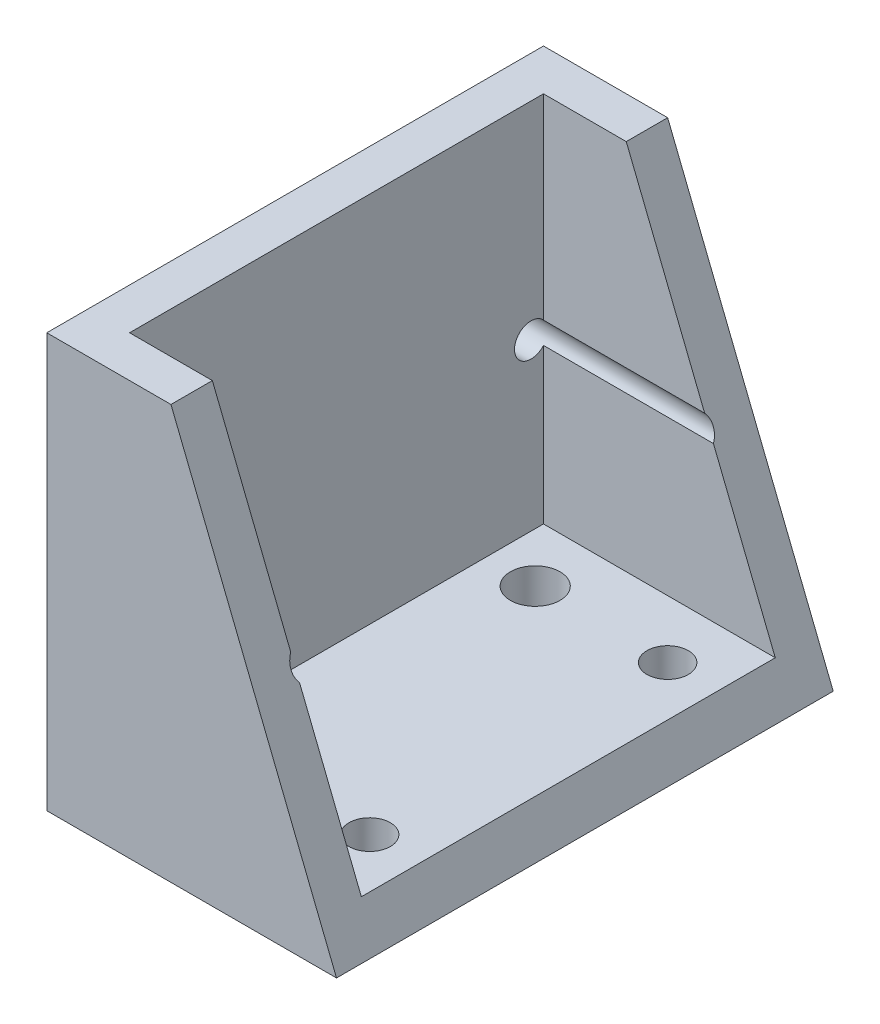
ISO-10303-21;
HEADER;
FILE_DESCRIPTION(('STEP AP214'),'2;1');
FILE_NAME('part.step','',(''),(''),'','','');
FILE_SCHEMA(('AUTOMOTIVE_DESIGN { 1 0 10303 214 1 1 1 1 }'));
ENDSEC;
DATA;
#1=APPLICATION_CONTEXT('core data for automotive mechanical design processes');
#2=APPLICATION_PROTOCOL_DEFINITION('international standard','automotive_design',2000,#1);
#3=PRODUCT_CONTEXT('',#1,'mechanical');
#4=PRODUCT('Part','Part','',(#3));
#5=PRODUCT_RELATED_PRODUCT_CATEGORY('part','',(#4));
#6=PRODUCT_DEFINITION_FORMATION('','',#4);
#7=PRODUCT_DEFINITION_CONTEXT('part definition',#1,'design');
#8=PRODUCT_DEFINITION('design','',#6,#7);
#9=PRODUCT_DEFINITION_SHAPE('','',#8);
#10=(LENGTH_UNIT() NAMED_UNIT(*) SI_UNIT(.MILLI.,.METRE.));
#11=(NAMED_UNIT(*) PLANE_ANGLE_UNIT() SI_UNIT($,.RADIAN.));
#12=(NAMED_UNIT(*) SI_UNIT($,.STERADIAN.) SOLID_ANGLE_UNIT());
#13=UNCERTAINTY_MEASURE_WITH_UNIT(LENGTH_MEASURE(1.E-05),#10,'distance_accuracy_value','');
#14=(GEOMETRIC_REPRESENTATION_CONTEXT(3) GLOBAL_UNCERTAINTY_ASSIGNED_CONTEXT((#13)) GLOBAL_UNIT_ASSIGNED_CONTEXT((#10,
#11,#12)) REPRESENTATION_CONTEXT('',''));
#15=CARTESIAN_POINT('',(0.,0.,0.));
#16=DIRECTION('',(0.,0.,1.));
#17=DIRECTION('',(1.,0.,0.));
#18=AXIS2_PLACEMENT_3D('',#15,#16,#17);
#19=CARTESIAN_POINT('',(-41.3425117527549,-2.12765957446807,5.));
#20=DIRECTION('',(0.,0.,-1.));
#21=DIRECTION('',(-1.,0.,0.));
#22=AXIS2_PLACEMENT_3D('',#19,#20,#21);
#23=PLANE('',#22);
#24=DIRECTION('',(0.371390676354104,-0.928476690885259,0.));
#25=VECTOR('',#24,1.);
#26=CARTESIAN_POINT('',(-31.3425117527549,42.8723404255319,4.99999999999999));
#27=LINE('',#26,#25);
#28=CARTESIAN_POINT('',(-20.813361490542,16.5494647699996,5.));
#29=VERTEX_POINT('',#28);
#30=CARTESIAN_POINT('',(-13.3425117527549,-2.12765957446807,5.));
#31=VERTEX_POINT('',#30);
#32=EDGE_CURVE('E134',#29,#31,#27,.T.);
#33=ORIENTED_EDGE('',*,*,#32,.F.);
#34=DIRECTION('',(-1.,0.,0.));
#35=VECTOR('',#34,1.);
#36=CARTESIAN_POINT('',(-11.3425117527549,16.5494647699996,5.));
#37=LINE('',#36,#35);
#38=CARTESIAN_POINT('',(-41.3425117527549,16.5494647699996,5.));
#39=VERTEX_POINT('',#38);
#40=EDGE_CURVE('E122',#29,#39,#37,.T.);
#41=ORIENTED_EDGE('',*,*,#40,.T.);
#42=DIRECTION('',(0.,1.,0.));
#43=VECTOR('',#42,1.);
#44=CARTESIAN_POINT('',(-41.3425117527549,-2.12765957446807,5.));
#45=LINE('',#44,#43);
#46=CARTESIAN_POINT('',(-41.3425117527549,-2.12765957446807,5.));
#47=VERTEX_POINT('',#46);
#48=EDGE_CURVE('E132',#47,#39,#45,.T.);
#49=ORIENTED_EDGE('',*,*,#48,.F.);
#50=DIRECTION('',(-1.,0.,0.));
#51=VECTOR('',#50,1.);
#52=CARTESIAN_POINT('',(-41.3425117527549,-2.12765957446807,5.));
#53=LINE('',#52,#51);
#54=EDGE_CURVE('E214',#31,#47,#53,.T.);
#55=ORIENTED_EDGE('',*,*,#54,.F.);
#56=EDGE_LOOP('',(#33,#41,#49,#55));
#57=FACE_BOUND('',#56,.T.);
#58=ADVANCED_FACE('F35',(#57),#23,.F.);
#59=CARTESIAN_POINT('',(-6.84445933843047,-2.12765957446807,55.));
#60=DIRECTION('',(0.,0.,1.));
#61=DIRECTION('',(1.,0.,0.));
#62=AXIS2_PLACEMENT_3D('',#59,#60,#61);
#63=PLANE('',#62);
#64=DIRECTION('',(-0.371390676354104,0.928476690885259,0.));
#65=VECTOR('',#64,1.);
#66=CARTESIAN_POINT('',(-31.3425117527549,42.8723404255319,55.));
#67=LINE('',#66,#65);
#68=CARTESIAN_POINT('',(-21.8716620149679,19.1952160810642,55.));
#69=VERTEX_POINT('',#68);
#70=CARTESIAN_POINT('',(-31.3425117527549,42.8723404255319,55.));
#71=VERTEX_POINT('',#70);
#72=EDGE_CURVE('E141',#69,#71,#67,.T.);
#73=ORIENTED_EDGE('',*,*,#72,.F.);
#74=DIRECTION('',(-1.,0.,0.));
#75=VECTOR('',#74,1.);
#76=CARTESIAN_POINT('',(-11.3425117527549,19.1952160810642,55.));
#77=LINE('',#76,#75);
#78=CARTESIAN_POINT('',(-41.3425117527549,19.1952160810642,55.));
#79=VERTEX_POINT('',#78);
#80=EDGE_CURVE('E234',#69,#79,#77,.T.);
#81=ORIENTED_EDGE('',*,*,#80,.T.);
#82=DIRECTION('',(0.,1.,0.));
#83=VECTOR('',#82,1.);
#84=CARTESIAN_POINT('',(-41.3425117527549,-2.12765957446807,55.));
#85=LINE('',#84,#83);
#86=CARTESIAN_POINT('',(-41.3425117527549,42.8723404255319,55.));
#87=VERTEX_POINT('',#86);
#88=EDGE_CURVE('E152',#79,#87,#85,.T.);
#89=ORIENTED_EDGE('',*,*,#88,.T.);
#90=DIRECTION('',(1.,0.,0.));
#91=VECTOR('',#90,1.);
#92=CARTESIAN_POINT('',(-6.84445933843047,42.8723404255319,55.));
#93=LINE('',#92,#91);
#94=EDGE_CURVE('E149',#87,#71,#93,.T.);
#95=ORIENTED_EDGE('',*,*,#94,.T.);
#96=EDGE_LOOP('',(#73,#81,#89,#95));
#97=FACE_BOUND('',#96,.T.);
#98=ADVANCED_FACE('F287',(#97),#63,.F.);
#99=CARTESIAN_POINT('',(-31.3425117527549,42.8723404255319,60.));
#100=DIRECTION('',(-0.928476690885259,-0.371390676354104,0.));
#101=DIRECTION('',(0.371390676354104,-0.928476690885259,0.));
#102=AXIS2_PLACEMENT_3D('',#99,#100,#101);
#103=PLANE('',#102);
#104=CARTESIAN_POINT('',(-13.3425117527549,-2.12765957446807,55.));
#105=VERTEX_POINT('',#104);
#106=CARTESIAN_POINT('',(-20.813361490542,16.5494647699996,55.));
#107=VERTEX_POINT('',#106);
#108=EDGE_CURVE('E144',#105,#107,#67,.T.);
#109=ORIENTED_EDGE('',*,*,#108,.T.);
#110=CARTESIAN_POINT('',(-21.3425117527549,17.8723404255319,53.5));
#111=DIRECTION('',(-0.928476690885259,-0.371390676354104,0.));
#112=DIRECTION('',(-0.371390676354104,0.928476690885259,0.));
#113=AXIS2_PLACEMENT_3D('',#110,#111,#112);
#114=ELLIPSE('',#113,2.15406592285381,2.);
#115=EDGE_CURVE('E231',#107,#69,#114,.T.);
#116=ORIENTED_EDGE('',*,*,#115,.T.);
#117=ORIENTED_EDGE('',*,*,#72,.T.);
#118=DIRECTION('',(0.,0.,-1.));
#119=VECTOR('',#118,1.);
#120=CARTESIAN_POINT('',(-31.3425117527549,42.8723404255319,60.));
#121=LINE('',#120,#119);
#122=CARTESIAN_POINT('',(-31.3425117527549,42.8723404255319,60.));
#123=VERTEX_POINT('',#122);
#124=EDGE_CURVE('E186',#123,#71,#121,.T.);
#125=ORIENTED_EDGE('',*,*,#124,.F.);
#126=DIRECTION('',(-0.371390676354104,0.928476690885259,0.));
#127=VECTOR('',#126,1.);
#128=CARTESIAN_POINT('',(-31.3425117527549,42.8723404255319,60.));
#129=LINE('',#128,#127);
#130=CARTESIAN_POINT('',(-11.3425117527549,-7.12765957446808,60.));
#131=VERTEX_POINT('',#130);
#132=EDGE_CURVE('E159',#131,#123,#129,.T.);
#133=ORIENTED_EDGE('',*,*,#132,.F.);
#134=DIRECTION('',(0.,0.,-1.));
#135=VECTOR('',#134,1.);
#136=CARTESIAN_POINT('',(-11.3425117527549,-7.12765957446808,60.));
#137=LINE('',#136,#135);
#138=CARTESIAN_POINT('',(-11.3425117527549,-7.12765957446808,0.));
#139=VERTEX_POINT('',#138);
#140=EDGE_CURVE('E169',#131,#139,#137,.T.);
#141=ORIENTED_EDGE('',*,*,#140,.T.);
#142=DIRECTION('',(-0.371390676354104,0.928476690885259,0.));
#143=VECTOR('',#142,1.);
#144=CARTESIAN_POINT('',(-31.3425117527549,42.8723404255319,0.));
#145=LINE('',#144,#143);
#146=CARTESIAN_POINT('',(-31.3425117527549,42.8723404255319,0.));
#147=VERTEX_POINT('',#146);
#148=EDGE_CURVE('E158',#139,#147,#145,.T.);
#149=ORIENTED_EDGE('',*,*,#148,.T.);
#150=CARTESIAN_POINT('',(-31.3425117527549,42.8723404255319,5.));
#151=VERTEX_POINT('',#150);
#152=EDGE_CURVE('E185',#151,#147,#121,.T.);
#153=ORIENTED_EDGE('',*,*,#152,.F.);
#154=CARTESIAN_POINT('',(-21.8716620149679,19.1952160810642,5.));
#155=VERTEX_POINT('',#154);
#156=EDGE_CURVE('E155',#151,#155,#27,.T.);
#157=ORIENTED_EDGE('',*,*,#156,.T.);
#158=CARTESIAN_POINT('',(-21.3425117527549,17.8723404255319,6.50000000000001));
#159=DIRECTION('',(-0.928476690885259,-0.371390676354104,0.));
#160=DIRECTION('',(-0.371390676354104,0.928476690885259,0.));
#161=AXIS2_PLACEMENT_3D('',#158,#159,#160);
#162=ELLIPSE('',#161,2.15406592285381,2.);
#163=EDGE_CURVE('E135',#155,#29,#162,.T.);
#164=ORIENTED_EDGE('',*,*,#163,.T.);
#165=ORIENTED_EDGE('',*,*,#32,.T.);
#166=DIRECTION('',(0.,0.,1.));
#167=VECTOR('',#166,1.);
#168=CARTESIAN_POINT('',(-13.3425117527549,-2.12765957446807,60.));
#169=LINE('',#168,#167);
#170=EDGE_CURVE('E127',#31,#105,#169,.T.);
#171=ORIENTED_EDGE('',*,*,#170,.T.);
#172=EDGE_LOOP('',(#109,#116,#117,#125,#133,#141,#149,#153,#157,#164,#165,#171));
#173=FACE_BOUND('',#172,.T.);
#174=ADVANCED_FACE('F37',(#173),#103,.F.);
#175=CARTESIAN_POINT('',(-46.3425117527549,42.8723404255319,60.));
#176=DIRECTION('',(0.,-1.,0.));
#177=DIRECTION('',(0.,0.,-1.));
#178=AXIS2_PLACEMENT_3D('',#175,#176,#177);
#179=PLANE('',#178);
#180=DIRECTION('',(0.,0.,1.));
#181=VECTOR('',#180,1.);
#182=CARTESIAN_POINT('',(-41.3425117527549,42.8723404255319,55.));
#183=LINE('',#182,#181);
#184=CARTESIAN_POINT('',(-41.3425117527549,42.8723404255319,5.));
#185=VERTEX_POINT('',#184);
#186=EDGE_CURVE('E206',#185,#87,#183,.T.);
#187=ORIENTED_EDGE('',*,*,#186,.F.);
#188=DIRECTION('',(1.,0.,0.));
#189=VECTOR('',#188,1.);
#190=CARTESIAN_POINT('',(-46.3425117527549,42.8723404255319,5.));
#191=LINE('',#190,#189);
#192=EDGE_CURVE('E189',#185,#151,#191,.T.);
#193=ORIENTED_EDGE('',*,*,#192,.T.);
#194=ORIENTED_EDGE('',*,*,#152,.T.);
#195=DIRECTION('',(-1.,0.,0.));
#196=VECTOR('',#195,1.);
#197=CARTESIAN_POINT('',(-46.3425117527549,42.8723404255319,0.));
#198=LINE('',#197,#196);
#199=CARTESIAN_POINT('',(-46.3425117527549,42.8723404255319,0.));
#200=VERTEX_POINT('',#199);
#201=EDGE_CURVE('E172',#147,#200,#198,.T.);
#202=ORIENTED_EDGE('',*,*,#201,.T.);
#203=DIRECTION('',(0.,0.,-1.));
#204=VECTOR('',#203,1.);
#205=CARTESIAN_POINT('',(-46.3425117527549,42.8723404255319,60.));
#206=LINE('',#205,#204);
#207=CARTESIAN_POINT('',(-46.3425117527549,42.8723404255319,60.));
#208=VERTEX_POINT('',#207);
#209=EDGE_CURVE('E182',#208,#200,#206,.T.);
#210=ORIENTED_EDGE('',*,*,#209,.F.);
#211=DIRECTION('',(-1.,0.,0.));
#212=VECTOR('',#211,1.);
#213=CARTESIAN_POINT('',(-46.3425117527549,42.8723404255319,60.));
#214=LINE('',#213,#212);
#215=EDGE_CURVE('E162',#123,#208,#214,.T.);
#216=ORIENTED_EDGE('',*,*,#215,.F.);
#217=ORIENTED_EDGE('',*,*,#124,.T.);
#218=ORIENTED_EDGE('',*,*,#94,.F.);
#219=EDGE_LOOP('',(#187,#193,#194,#202,#210,#216,#217,#218));
#220=FACE_BOUND('',#219,.T.);
#221=ADVANCED_FACE('F253',(#220),#179,.F.);
#222=CARTESIAN_POINT('',(-46.3425117527549,-7.12765957446808,60.));
#223=DIRECTION('',(1.,0.,0.));
#224=DIRECTION('',(0.,0.,-1.));
#225=AXIS2_PLACEMENT_3D('',#222,#223,#224);
#226=PLANE('',#225);
#227=CARTESIAN_POINT('',(-46.3425117527549,17.8723404255319,53.5));
#228=DIRECTION('',(-1.,0.,0.));
#229=DIRECTION('',(0.,0.,1.));
#230=AXIS2_PLACEMENT_3D('',#227,#228,#229);
#231=CIRCLE('',#230,2.);
#232=CARTESIAN_POINT('',(-46.3425117527549,17.8723404255319,55.5));
#233=VERTEX_POINT('',#232);
#234=EDGE_CURVE('E240',#233,#233,#231,.T.);
#235=ORIENTED_EDGE('',*,*,#234,.F.);
#236=EDGE_LOOP('',(#235));
#237=FACE_BOUND('',#236,.T.);
#238=CARTESIAN_POINT('',(-46.3425117527549,17.8723404255319,6.50000000000001));
#239=DIRECTION('',(-1.,0.,0.));
#240=DIRECTION('',(0.,0.,-1.));
#241=AXIS2_PLACEMENT_3D('',#238,#239,#240);
#242=CIRCLE('',#241,2.);
#243=CARTESIAN_POINT('',(-46.3425117527549,17.8723404255319,4.5));
#244=VERTEX_POINT('',#243);
#245=EDGE_CURVE('E241',#244,#244,#242,.T.);
#246=ORIENTED_EDGE('',*,*,#245,.F.);
#247=EDGE_LOOP('',(#246));
#248=FACE_BOUND('',#247,.T.);
#249=DIRECTION('',(0.,-1.,0.));
#250=VECTOR('',#249,1.);
#251=CARTESIAN_POINT('',(-46.3425117527549,-7.12765957446808,0.));
#252=LINE('',#251,#250);
#253=CARTESIAN_POINT('',(-46.3425117527549,-7.12765957446808,0.));
#254=VERTEX_POINT('',#253);
#255=EDGE_CURVE('E174',#200,#254,#252,.T.);
#256=ORIENTED_EDGE('',*,*,#255,.T.);
#257=DIRECTION('',(0.,0.,-1.));
#258=VECTOR('',#257,1.);
#259=CARTESIAN_POINT('',(-46.3425117527549,-7.12765957446808,60.));
#260=LINE('',#259,#258);
#261=CARTESIAN_POINT('',(-46.3425117527549,-7.12765957446808,60.));
#262=VERTEX_POINT('',#261);
#263=EDGE_CURVE('E179',#262,#254,#260,.T.);
#264=ORIENTED_EDGE('',*,*,#263,.F.);
#265=DIRECTION('',(0.,-1.,0.));
#266=VECTOR('',#265,1.);
#267=CARTESIAN_POINT('',(-46.3425117527549,-7.12765957446808,60.));
#268=LINE('',#267,#266);
#269=EDGE_CURVE('E165',#208,#262,#268,.T.);
#270=ORIENTED_EDGE('',*,*,#269,.F.);
#271=ORIENTED_EDGE('',*,*,#209,.T.);
#272=EDGE_LOOP('',(#256,#264,#270,#271));
#273=FACE_BOUND('',#272,.T.);
#274=ADVANCED_FACE('F249',(#237,#248,#273),#226,.F.);
#275=CARTESIAN_POINT('',(-11.3425117527549,-7.12765957446808,60.));
#276=DIRECTION('',(0.,1.,0.));
#277=DIRECTION('',(0.,0.,1.));
#278=AXIS2_PLACEMENT_3D('',#275,#276,#277);
#279=PLANE('',#278);
#280=CARTESIAN_POINT('',(-35.342511752755,-7.12765957446808,12.));
#281=DIRECTION('',(0.,-1.,0.));
#282=DIRECTION('',(-1.,0.,0.));
#283=AXIS2_PLACEMENT_3D('',#280,#281,#282);
#284=CIRCLE('',#283,3.);
#285=CARTESIAN_POINT('',(-38.342511752755,-7.12765957446808,12.));
#286=VERTEX_POINT('',#285);
#287=EDGE_CURVE('E222',#286,#286,#284,.T.);
#288=ORIENTED_EDGE('',*,*,#287,.F.);
#289=EDGE_LOOP('',(#288));
#290=FACE_BOUND('',#289,.T.);
#291=CARTESIAN_POINT('',(-19.3425117527549,-7.12765957446808,48.));
#292=DIRECTION('',(0.,-1.,0.));
#293=DIRECTION('',(1.,0.,0.));
#294=AXIS2_PLACEMENT_3D('',#291,#292,#293);
#295=CIRCLE('',#294,2.5);
#296=CARTESIAN_POINT('',(-16.8425117527549,-7.12765957446808,48.));
#297=VERTEX_POINT('',#296);
#298=EDGE_CURVE('E223',#297,#297,#295,.T.);
#299=ORIENTED_EDGE('',*,*,#298,.F.);
#300=EDGE_LOOP('',(#299));
#301=FACE_BOUND('',#300,.T.);
#302=CARTESIAN_POINT('',(-19.3425117527549,-7.12765957446808,12.));
#303=DIRECTION('',(0.,-1.,0.));
#304=DIRECTION('',(-1.,0.,0.));
#305=AXIS2_PLACEMENT_3D('',#302,#303,#304);
#306=CIRCLE('',#305,2.5);
#307=CARTESIAN_POINT('',(-21.842511752755,-7.12765957446808,12.));
#308=VERTEX_POINT('',#307);
#309=EDGE_CURVE('E226',#308,#308,#306,.T.);
#310=ORIENTED_EDGE('',*,*,#309,.F.);
#311=EDGE_LOOP('',(#310));
#312=FACE_BOUND('',#311,.T.);
#313=CARTESIAN_POINT('',(-35.342511752755,-7.12765957446808,48.));
#314=DIRECTION('',(0.,-1.,0.));
#315=DIRECTION('',(1.,0.,0.));
#316=AXIS2_PLACEMENT_3D('',#313,#314,#315);
#317=CIRCLE('',#316,3.);
#318=CARTESIAN_POINT('',(-32.3425117527549,-7.12765957446808,48.));
#319=VERTEX_POINT('',#318);
#320=EDGE_CURVE('E198',#319,#319,#317,.T.);
#321=ORIENTED_EDGE('',*,*,#320,.F.);
#322=EDGE_LOOP('',(#321));
#323=FACE_BOUND('',#322,.T.);
#324=DIRECTION('',(1.,0.,0.));
#325=VECTOR('',#324,1.);
#326=CARTESIAN_POINT('',(-11.3425117527549,-7.12765957446808,0.));
#327=LINE('',#326,#325);
#328=EDGE_CURVE('E163',#254,#139,#327,.T.);
#329=ORIENTED_EDGE('',*,*,#328,.T.);
#330=ORIENTED_EDGE('',*,*,#140,.F.);
#331=DIRECTION('',(1.,0.,0.));
#332=VECTOR('',#331,1.);
#333=CARTESIAN_POINT('',(-11.3425117527549,-7.12765957446808,60.));
#334=LINE('',#333,#332);
#335=EDGE_CURVE('E167',#262,#131,#334,.T.);
#336=ORIENTED_EDGE('',*,*,#335,.F.);
#337=ORIENTED_EDGE('',*,*,#263,.T.);
#338=EDGE_LOOP('',(#329,#330,#336,#337));
#339=FACE_BOUND('',#338,.T.);
#340=ADVANCED_FACE('F252',(#290,#301,#312,#323,#339),#279,.F.);
#341=CARTESIAN_POINT('',(0.,0.,60.));
#342=DIRECTION('',(0.,0.,-1.));
#343=DIRECTION('',(-1.,0.,0.));
#344=AXIS2_PLACEMENT_3D('',#341,#342,#343);
#345=PLANE('',#344);
#346=ORIENTED_EDGE('',*,*,#132,.T.);
#347=ORIENTED_EDGE('',*,*,#215,.T.);
#348=ORIENTED_EDGE('',*,*,#269,.T.);
#349=ORIENTED_EDGE('',*,*,#335,.T.);
#350=EDGE_LOOP('',(#346,#347,#348,#349));
#351=FACE_BOUND('',#350,.T.);
#352=ADVANCED_FACE('F274',(#351),#345,.F.);
#353=CARTESIAN_POINT('',(0.,0.,0.));
#354=DIRECTION('',(0.,0.,-1.));
#355=DIRECTION('',(-1.,0.,0.));
#356=AXIS2_PLACEMENT_3D('',#353,#354,#355);
#357=PLANE('',#356);
#358=ORIENTED_EDGE('',*,*,#148,.F.);
#359=ORIENTED_EDGE('',*,*,#328,.F.);
#360=ORIENTED_EDGE('',*,*,#255,.F.);
#361=ORIENTED_EDGE('',*,*,#201,.F.);
#362=EDGE_LOOP('',(#358,#359,#360,#361));
#363=FACE_BOUND('',#362,.T.);
#364=ADVANCED_FACE('F268',(#363),#357,.T.);
#365=CARTESIAN_POINT('',(0.,-2.12765957446807,0.));
#366=DIRECTION('',(0.,-1.,0.));
#367=DIRECTION('',(0.,0.,-1.));
#368=AXIS2_PLACEMENT_3D('',#365,#366,#367);
#369=PLANE('',#368);
#370=CARTESIAN_POINT('',(-35.342511752755,-2.12765957446807,12.));
#371=DIRECTION('',(0.,-1.,0.));
#372=DIRECTION('',(0.,0.,-1.));
#373=AXIS2_PLACEMENT_3D('',#370,#371,#372);
#374=CIRCLE('',#373,3.);
#375=CARTESIAN_POINT('',(-35.342511752755,-2.12765957446807,9.));
#376=VERTEX_POINT('',#375);
#377=EDGE_CURVE('E204',#376,#376,#374,.T.);
#378=ORIENTED_EDGE('',*,*,#377,.T.);
#379=EDGE_LOOP('',(#378));
#380=FACE_BOUND('',#379,.T.);
#381=CARTESIAN_POINT('',(-19.3425117527549,-2.12765957446807,48.));
#382=DIRECTION('',(0.,-1.,0.));
#383=DIRECTION('',(0.,0.,-1.));
#384=AXIS2_PLACEMENT_3D('',#381,#382,#383);
#385=CIRCLE('',#384,2.5);
#386=CARTESIAN_POINT('',(-19.3425117527549,-2.12765957446807,45.5));
#387=VERTEX_POINT('',#386);
#388=EDGE_CURVE('E201',#387,#387,#385,.T.);
#389=ORIENTED_EDGE('',*,*,#388,.T.);
#390=EDGE_LOOP('',(#389));
#391=FACE_BOUND('',#390,.T.);
#392=CARTESIAN_POINT('',(-19.3425117527549,-2.12765957446807,12.));
#393=DIRECTION('',(0.,-1.,0.));
#394=DIRECTION('',(0.,0.,-1.));
#395=AXIS2_PLACEMENT_3D('',#392,#393,#394);
#396=CIRCLE('',#395,2.5);
#397=CARTESIAN_POINT('',(-19.3425117527549,-2.12765957446807,9.49999999999999));
#398=VERTEX_POINT('',#397);
#399=EDGE_CURVE('E197',#398,#398,#396,.T.);
#400=ORIENTED_EDGE('',*,*,#399,.T.);
#401=EDGE_LOOP('',(#400));
#402=FACE_BOUND('',#401,.T.);
#403=CARTESIAN_POINT('',(-35.342511752755,-2.12765957446807,48.));
#404=DIRECTION('',(0.,-1.,0.));
#405=DIRECTION('',(0.,0.,-1.));
#406=AXIS2_PLACEMENT_3D('',#403,#404,#405);
#407=CIRCLE('',#406,3.);
#408=CARTESIAN_POINT('',(-35.342511752755,-2.12765957446807,45.));
#409=VERTEX_POINT('',#408);
#410=EDGE_CURVE('E194',#409,#409,#407,.T.);
#411=ORIENTED_EDGE('',*,*,#410,.T.);
#412=EDGE_LOOP('',(#411));
#413=FACE_BOUND('',#412,.T.);
#414=ORIENTED_EDGE('',*,*,#54,.T.);
#415=DIRECTION('',(0.,0.,1.));
#416=VECTOR('',#415,1.);
#417=CARTESIAN_POINT('',(-41.3425117527549,-2.12765957446807,55.));
#418=LINE('',#417,#416);
#419=CARTESIAN_POINT('',(-41.3425117527549,-2.12765957446807,55.));
#420=VERTEX_POINT('',#419);
#421=EDGE_CURVE('E140',#47,#420,#418,.T.);
#422=ORIENTED_EDGE('',*,*,#421,.T.);
#423=DIRECTION('',(1.,0.,0.));
#424=VECTOR('',#423,1.);
#425=CARTESIAN_POINT('',(-6.84445933843047,-2.12765957446807,55.));
#426=LINE('',#425,#424);
#427=EDGE_CURVE('E216',#420,#105,#426,.T.);
#428=ORIENTED_EDGE('',*,*,#427,.T.);
#429=ORIENTED_EDGE('',*,*,#170,.F.);
#430=EDGE_LOOP('',(#414,#422,#428,#429));
#431=FACE_BOUND('',#430,.T.);
#432=ADVANCED_FACE('F281',(#380,#391,#402,#413,#431),#369,.F.);
#433=CARTESIAN_POINT('',(-41.3425117527549,19.1952160810642,5.));
#434=VERTEX_POINT('',#433);
#435=EDGE_CURVE('E142',#434,#185,#45,.T.);
#436=ORIENTED_EDGE('',*,*,#435,.F.);
#437=DIRECTION('',(-1.,0.,0.));
#438=VECTOR('',#437,1.);
#439=CARTESIAN_POINT('',(-11.3425117527549,19.1952160810642,5.));
#440=LINE('',#439,#438);
#441=EDGE_CURVE('E50',#434,#155,#440,.F.);
#442=ORIENTED_EDGE('',*,*,#441,.T.);
#443=ORIENTED_EDGE('',*,*,#156,.F.);
#444=ORIENTED_EDGE('',*,*,#192,.F.);
#445=EDGE_LOOP('',(#436,#442,#443,#444));
#446=FACE_BOUND('',#445,.T.);
#447=ADVANCED_FACE('F278',(#446),#23,.F.);
#448=CARTESIAN_POINT('',(-41.3425117527549,16.5494647699996,55.));
#449=VERTEX_POINT('',#448);
#450=EDGE_CURVE('E146',#420,#449,#85,.T.);
#451=ORIENTED_EDGE('',*,*,#450,.T.);
#452=DIRECTION('',(-1.,0.,0.));
#453=VECTOR('',#452,1.);
#454=CARTESIAN_POINT('',(-11.3425117527549,16.5494647699996,55.));
#455=LINE('',#454,#453);
#456=EDGE_CURVE('E58',#449,#107,#455,.F.);
#457=ORIENTED_EDGE('',*,*,#456,.T.);
#458=ORIENTED_EDGE('',*,*,#108,.F.);
#459=ORIENTED_EDGE('',*,*,#427,.F.);
#460=EDGE_LOOP('',(#451,#457,#458,#459));
#461=FACE_BOUND('',#460,.T.);
#462=ADVANCED_FACE('F284',(#461),#63,.F.);
#463=CARTESIAN_POINT('',(-41.3425117527549,-2.12765957446807,55.));
#464=DIRECTION('',(-1.,0.,0.));
#465=DIRECTION('',(0.,0.,1.));
#466=AXIS2_PLACEMENT_3D('',#463,#464,#465);
#467=PLANE('',#466);
#468=ORIENTED_EDGE('',*,*,#88,.F.);
#469=CARTESIAN_POINT('',(-41.3425117527549,17.8723404255319,53.5));
#470=DIRECTION('',(-1.,0.,0.));
#471=DIRECTION('',(0.,0.,1.));
#472=AXIS2_PLACEMENT_3D('',#469,#470,#471);
#473=CIRCLE('',#472,2.);
#474=EDGE_CURVE('E11',#79,#449,#473,.T.);
#475=ORIENTED_EDGE('',*,*,#474,.T.);
#476=ORIENTED_EDGE('',*,*,#450,.F.);
#477=ORIENTED_EDGE('',*,*,#421,.F.);
#478=ORIENTED_EDGE('',*,*,#48,.T.);
#479=CARTESIAN_POINT('',(-41.3425117527549,17.8723404255319,6.50000000000001));
#480=DIRECTION('',(-1.,0.,0.));
#481=DIRECTION('',(0.,0.,1.));
#482=AXIS2_PLACEMENT_3D('',#479,#480,#481);
#483=CIRCLE('',#482,2.);
#484=EDGE_CURVE('E43',#39,#434,#483,.T.);
#485=ORIENTED_EDGE('',*,*,#484,.T.);
#486=ORIENTED_EDGE('',*,*,#435,.T.);
#487=ORIENTED_EDGE('',*,*,#186,.T.);
#488=EDGE_LOOP('',(#468,#475,#476,#477,#478,#485,#486,#487));
#489=FACE_BOUND('',#488,.T.);
#490=ADVANCED_FACE('F138',(#489),#467,.F.);
#491=CARTESIAN_POINT('',(-35.342511752755,42.8723404255319,48.));
#492=DIRECTION('',(0.,-1.,0.));
#493=DIRECTION('',(1.,0.,0.));
#494=AXIS2_PLACEMENT_3D('',#491,#492,#493);
#495=CYLINDRICAL_SURFACE('',#494,3.);
#496=ORIENTED_EDGE('',*,*,#320,.T.);
#497=EDGE_LOOP('',(#496));
#498=FACE_BOUND('',#497,.T.);
#499=ORIENTED_EDGE('',*,*,#410,.F.);
#500=EDGE_LOOP('',(#499));
#501=FACE_BOUND('',#500,.T.);
#502=ADVANCED_FACE('F314',(#498,#501),#495,.F.);
#503=CARTESIAN_POINT('',(-19.342511752755,42.8723404255319,12.));
#504=DIRECTION('',(0.,-1.,0.));
#505=DIRECTION('',(1.,0.,0.));
#506=AXIS2_PLACEMENT_3D('',#503,#504,#505);
#507=CYLINDRICAL_SURFACE('',#506,2.5);
#508=ORIENTED_EDGE('',*,*,#309,.T.);
#509=EDGE_LOOP('',(#508));
#510=FACE_BOUND('',#509,.T.);
#511=ORIENTED_EDGE('',*,*,#399,.F.);
#512=EDGE_LOOP('',(#511));
#513=FACE_BOUND('',#512,.T.);
#514=ADVANCED_FACE('F317',(#510,#513),#507,.F.);
#515=CARTESIAN_POINT('',(-19.342511752755,42.8723404255319,48.));
#516=DIRECTION('',(0.,-1.,0.));
#517=DIRECTION('',(1.,0.,0.));
#518=AXIS2_PLACEMENT_3D('',#515,#516,#517);
#519=CYLINDRICAL_SURFACE('',#518,2.5);
#520=ORIENTED_EDGE('',*,*,#298,.T.);
#521=EDGE_LOOP('',(#520));
#522=FACE_BOUND('',#521,.T.);
#523=ORIENTED_EDGE('',*,*,#388,.F.);
#524=EDGE_LOOP('',(#523));
#525=FACE_BOUND('',#524,.T.);
#526=ADVANCED_FACE('F319',(#522,#525),#519,.F.);
#527=CARTESIAN_POINT('',(-35.342511752755,42.8723404255319,12.));
#528=DIRECTION('',(0.,-1.,0.));
#529=DIRECTION('',(1.,0.,0.));
#530=AXIS2_PLACEMENT_3D('',#527,#528,#529);
#531=CYLINDRICAL_SURFACE('',#530,3.);
#532=ORIENTED_EDGE('',*,*,#287,.T.);
#533=EDGE_LOOP('',(#532));
#534=FACE_BOUND('',#533,.T.);
#535=ORIENTED_EDGE('',*,*,#377,.F.);
#536=EDGE_LOOP('',(#535));
#537=FACE_BOUND('',#536,.T.);
#538=ADVANCED_FACE('F293',(#534,#537),#531,.F.);
#539=CARTESIAN_POINT('',(-11.3425117527549,17.8723404255319,6.50000000000001));
#540=DIRECTION('',(-1.,0.,0.));
#541=DIRECTION('',(0.,0.,1.));
#542=AXIS2_PLACEMENT_3D('',#539,#540,#541);
#543=CYLINDRICAL_SURFACE('',#542,2.);
#544=ORIENTED_EDGE('',*,*,#245,.T.);
#545=EDGE_LOOP('',(#544));
#546=FACE_BOUND('',#545,.T.);
#547=ORIENTED_EDGE('',*,*,#441,.F.);
#548=ORIENTED_EDGE('',*,*,#484,.F.);
#549=ORIENTED_EDGE('',*,*,#40,.F.);
#550=ORIENTED_EDGE('',*,*,#163,.F.);
#551=EDGE_LOOP('',(#547,#548,#549,#550));
#552=FACE_BOUND('',#551,.T.);
#553=ADVANCED_FACE('F121',(#546,#552),#543,.F.);
#554=CARTESIAN_POINT('',(-11.3425117527549,17.8723404255319,53.5));
#555=DIRECTION('',(-1.,0.,0.));
#556=DIRECTION('',(0.,0.,1.));
#557=AXIS2_PLACEMENT_3D('',#554,#555,#556);
#558=CYLINDRICAL_SURFACE('',#557,2.);
#559=ORIENTED_EDGE('',*,*,#234,.T.);
#560=EDGE_LOOP('',(#559));
#561=FACE_BOUND('',#560,.T.);
#562=ORIENTED_EDGE('',*,*,#456,.F.);
#563=ORIENTED_EDGE('',*,*,#474,.F.);
#564=ORIENTED_EDGE('',*,*,#80,.F.);
#565=ORIENTED_EDGE('',*,*,#115,.F.);
#566=EDGE_LOOP('',(#562,#563,#564,#565));
#567=FACE_BOUND('',#566,.T.);
#568=ADVANCED_FACE('F247',(#561,#567),#558,.F.);
#569=CLOSED_SHELL('',(#58,#98,#174,#221,#274,#340,#352,#364,#432,#447,#462,#490,#502,#514,#526,
#538,#553,#568));
#570=MANIFOLD_SOLID_BREP('B2',#569);
#571=ADVANCED_BREP_SHAPE_REPRESENTATION('',(#18,#570),#14);
#572=SHAPE_DEFINITION_REPRESENTATION(#9,#571);
ENDSEC;
END-ISO-10303-21;
